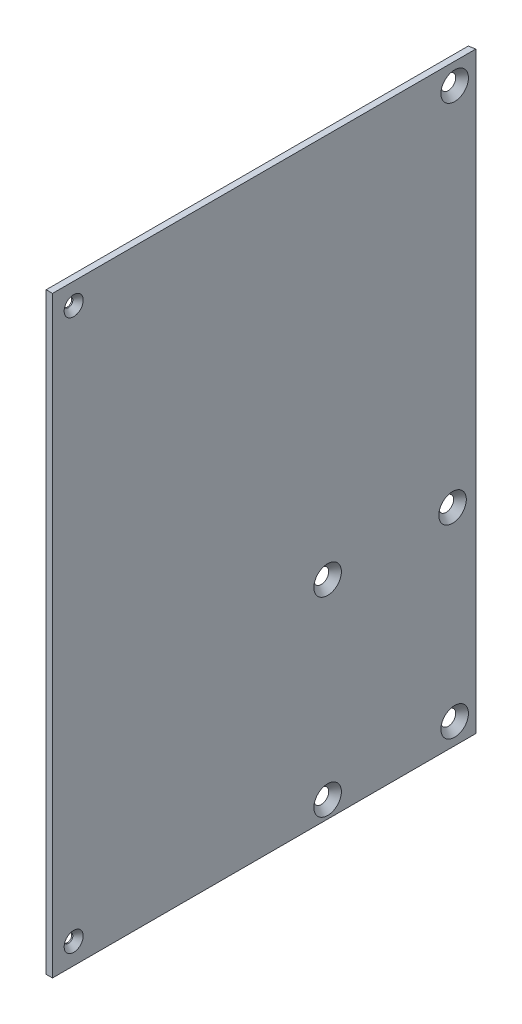
ISO-10303-21;
HEADER;
FILE_DESCRIPTION(('STEP AP214'),'2;1');
FILE_NAME('part.step','',(''),(''),'','','');
FILE_SCHEMA(('AUTOMOTIVE_DESIGN { 1 0 10303 214 1 1 1 1 }'));
ENDSEC;
DATA;
#1=APPLICATION_CONTEXT('core data for automotive mechanical design processes');
#2=APPLICATION_PROTOCOL_DEFINITION('international standard','automotive_design',2000,#1);
#3=PRODUCT_CONTEXT('',#1,'mechanical');
#4=PRODUCT('Part','Part','',(#3));
#5=PRODUCT_RELATED_PRODUCT_CATEGORY('part','',(#4));
#6=PRODUCT_DEFINITION_FORMATION('','',#4);
#7=PRODUCT_DEFINITION_CONTEXT('part definition',#1,'design');
#8=PRODUCT_DEFINITION('design','',#6,#7);
#9=PRODUCT_DEFINITION_SHAPE('','',#8);
#10=(LENGTH_UNIT() NAMED_UNIT(*) SI_UNIT(.MILLI.,.METRE.));
#11=(NAMED_UNIT(*) PLANE_ANGLE_UNIT() SI_UNIT($,.RADIAN.));
#12=(NAMED_UNIT(*) SI_UNIT($,.STERADIAN.) SOLID_ANGLE_UNIT());
#13=UNCERTAINTY_MEASURE_WITH_UNIT(LENGTH_MEASURE(1.E-05),#10,'distance_accuracy_value','');
#14=(GEOMETRIC_REPRESENTATION_CONTEXT(3) GLOBAL_UNCERTAINTY_ASSIGNED_CONTEXT((#13)) GLOBAL_UNIT_ASSIGNED_CONTEXT((#10,
#11,#12)) REPRESENTATION_CONTEXT('',''));
#15=CARTESIAN_POINT('',(0.,0.,0.));
#16=DIRECTION('',(0.,0.,1.));
#17=DIRECTION('',(1.,0.,0.));
#18=AXIS2_PLACEMENT_3D('',#15,#16,#17);
#19=CARTESIAN_POINT('',(82.9035305009001,138.,134.399262949457));
#20=DIRECTION('',(1.,0.,0.));
#21=DIRECTION('',(0.,0.,-1.));
#22=AXIS2_PLACEMENT_3D('',#19,#20,#21);
#23=CONICAL_SURFACE('',#22,2.25,0.785398163397448);
#24=CARTESIAN_POINT('',(81.6785305009001,138.,134.399262949457));
#25=DIRECTION('',(1.,0.,0.));
#26=DIRECTION('',(0.,0.,-1.));
#27=AXIS2_PLACEMENT_3D('',#24,#25,#26);
#28=CIRCLE('',#27,1.025);
#29=CARTESIAN_POINT('',(81.6785305009001,138.,133.374262949457));
#30=VERTEX_POINT('',#29);
#31=EDGE_CURVE('E187',#30,#30,#28,.T.);
#32=ORIENTED_EDGE('',*,*,#31,.F.);
#33=EDGE_LOOP('',(#32));
#34=FACE_BOUND('',#33,.T.);
#35=CARTESIAN_POINT('',(82.9035305009001,138.,134.399262949457));
#36=DIRECTION('',(1.,0.,0.));
#37=DIRECTION('',(0.,0.,-1.));
#38=AXIS2_PLACEMENT_3D('',#35,#36,#37);
#39=CIRCLE('',#38,2.25);
#40=CARTESIAN_POINT('',(82.9035305009001,138.,132.149262949457));
#41=VERTEX_POINT('',#40);
#42=EDGE_CURVE('E183',#41,#41,#39,.T.);
#43=ORIENTED_EDGE('',*,*,#42,.T.);
#44=EDGE_LOOP('',(#43));
#45=FACE_BOUND('',#44,.T.);
#46=ADVANCED_FACE('F52',(#34,#45),#23,.F.);
#47=CARTESIAN_POINT('',(82.9035305009001,138.,134.399262949457));
#48=DIRECTION('',(1.,0.,0.));
#49=DIRECTION('',(0.,0.,-1.));
#50=AXIS2_PLACEMENT_3D('',#47,#48,#49);
#51=CYLINDRICAL_SURFACE('',#50,1.025);
#52=ORIENTED_EDGE('',*,*,#31,.T.);
#53=EDGE_LOOP('',(#52));
#54=FACE_BOUND('',#53,.T.);
#55=CARTESIAN_POINT('',(81.4035305009001,138.,134.399262949457));
#56=DIRECTION('',(-1.,0.,0.));
#57=DIRECTION('',(0.,0.,1.));
#58=AXIS2_PLACEMENT_3D('',#55,#56,#57);
#59=CIRCLE('',#58,1.025);
#60=CARTESIAN_POINT('',(81.4035305009001,138.,135.424262949457));
#61=VERTEX_POINT('',#60);
#62=EDGE_CURVE('E175',#61,#61,#59,.F.);
#63=ORIENTED_EDGE('',*,*,#62,.F.);
#64=EDGE_LOOP('',(#63));
#65=FACE_BOUND('',#64,.T.);
#66=ADVANCED_FACE('F219',(#54,#65),#51,.F.);
#67=CARTESIAN_POINT('',(82.9035305009001,138.,44.4332950003212));
#68=DIRECTION('',(1.,0.,0.));
#69=DIRECTION('',(0.,0.,-1.));
#70=AXIS2_PLACEMENT_3D('',#67,#68,#69);
#71=CONICAL_SURFACE('',#70,3.25,0.785398163397448);
#72=CARTESIAN_POINT('',(82.9035305009001,138.,44.4332950003212));
#73=DIRECTION('',(1.,0.,0.));
#74=DIRECTION('',(0.,0.,-1.));
#75=AXIS2_PLACEMENT_3D('',#72,#73,#74);
#76=CIRCLE('',#75,3.25);
#77=CARTESIAN_POINT('',(82.9035305009001,138.,41.1832950003211));
#78=VERTEX_POINT('',#77);
#79=EDGE_CURVE('E179',#78,#78,#76,.T.);
#80=ORIENTED_EDGE('',*,*,#79,.T.);
#81=EDGE_LOOP('',(#80));
#82=FACE_BOUND('',#81,.T.);
#83=CARTESIAN_POINT('',(81.4035305009001,138.,44.4332950003212));
#84=DIRECTION('',(-1.,0.,0.));
#85=DIRECTION('',(0.,0.,1.));
#86=AXIS2_PLACEMENT_3D('',#83,#84,#85);
#87=CIRCLE('',#86,1.75);
#88=CARTESIAN_POINT('',(81.4035305009001,138.,46.1832950003212));
#89=VERTEX_POINT('',#88);
#90=EDGE_CURVE('E171',#89,#89,#87,.F.);
#91=ORIENTED_EDGE('',*,*,#90,.F.);
#92=EDGE_LOOP('',(#91));
#93=FACE_BOUND('',#92,.T.);
#94=ADVANCED_FACE('F227',(#82,#93),#71,.F.);
#95=CARTESIAN_POINT('',(80.9035305009001,143.,39.4332950003212));
#96=DIRECTION('',(0.,1.,0.));
#97=DIRECTION('',(0.,0.,1.));
#98=AXIS2_PLACEMENT_3D('',#95,#96,#97);
#99=PLANE('',#98);
#100=DIRECTION('',(-0.983268675216208,0.,0.18216122622162));
#101=VECTOR('',#100,1.);
#102=CARTESIAN_POINT('',(80.9035305009001,143.,39.8038167728806));
#103=LINE('',#102,#101);
#104=CARTESIAN_POINT('',(82.9035305009001,143.,39.4332950003212));
#105=VERTEX_POINT('',#104);
#106=CARTESIAN_POINT('',(81.4035305009001,143.,39.7111863297407));
#107=VERTEX_POINT('',#106);
#108=EDGE_CURVE('E191',#105,#107,#103,.T.);
#109=ORIENTED_EDGE('',*,*,#108,.T.);
#110=DIRECTION('',(0.,0.,-1.));
#111=VECTOR('',#110,1.);
#112=CARTESIAN_POINT('',(81.4035305009001,143.,139.399262949457));
#113=LINE('',#112,#111);
#114=CARTESIAN_POINT('',(81.4035305009001,143.,139.399262949457));
#115=VERTEX_POINT('',#114);
#116=EDGE_CURVE('E166',#115,#107,#113,.T.);
#117=ORIENTED_EDGE('',*,*,#116,.F.);
#118=DIRECTION('',(1.,0.,0.));
#119=VECTOR('',#118,1.);
#120=CARTESIAN_POINT('',(80.9035305009001,143.,139.399262949457));
#121=LINE('',#120,#119);
#122=CARTESIAN_POINT('',(82.9035305009001,143.,139.399262949457));
#123=VERTEX_POINT('',#122);
#124=EDGE_CURVE('E11',#115,#123,#121,.T.);
#125=ORIENTED_EDGE('',*,*,#124,.T.);
#126=DIRECTION('',(0.,0.,1.));
#127=VECTOR('',#126,1.);
#128=CARTESIAN_POINT('',(82.9035305009001,143.,39.4332950003212));
#129=LINE('',#128,#127);
#130=EDGE_CURVE('E97',#105,#123,#129,.T.);
#131=ORIENTED_EDGE('',*,*,#130,.F.);
#132=EDGE_LOOP('',(#109,#117,#125,#131));
#133=FACE_BOUND('',#132,.T.);
#134=ADVANCED_FACE('F54',(#133),#99,.T.);
#135=CARTESIAN_POINT('',(81.4035305009001,-34.,0.));
#136=DIRECTION('',(-1.,0.,0.));
#137=DIRECTION('',(0.,0.,1.));
#138=AXIS2_PLACEMENT_3D('',#135,#136,#137);
#139=PLANE('',#138);
#140=DIRECTION('',(0.,-1.,0.));
#141=VECTOR('',#140,1.);
#142=CARTESIAN_POINT('',(81.4035305009001,146.,39.7111863297407));
#143=LINE('',#142,#141);
#144=CARTESIAN_POINT('',(81.4035305009001,3.,39.7111863297407));
#145=VERTEX_POINT('',#144);
#146=EDGE_CURVE('E130',#107,#145,#143,.T.);
#147=ORIENTED_EDGE('',*,*,#146,.T.);
#148=DIRECTION('',(0.,0.,1.));
#149=VECTOR('',#148,1.);
#150=CARTESIAN_POINT('',(81.4035305009001,3.,39.8038167728806));
#151=LINE('',#150,#149);
#152=CARTESIAN_POINT('',(81.4035305009001,3.,139.399262949457));
#153=VERTEX_POINT('',#152);
#154=EDGE_CURVE('E125',#145,#153,#151,.T.);
#155=ORIENTED_EDGE('',*,*,#154,.T.);
#156=DIRECTION('',(0.,1.,0.));
#157=VECTOR('',#156,1.);
#158=CARTESIAN_POINT('',(81.4035305009001,-31.,139.399262949457));
#159=LINE('',#158,#157);
#160=EDGE_CURVE('E103',#153,#115,#159,.T.);
#161=ORIENTED_EDGE('',*,*,#160,.T.);
#162=ORIENTED_EDGE('',*,*,#116,.T.);
#163=EDGE_LOOP('',(#147,#155,#161,#162));
#164=FACE_BOUND('',#163,.T.);
#165=ORIENTED_EDGE('',*,*,#90,.T.);
#166=EDGE_LOOP('',(#165));
#167=FACE_BOUND('',#166,.T.);
#168=ORIENTED_EDGE('',*,*,#62,.T.);
#169=EDGE_LOOP('',(#168));
#170=FACE_BOUND('',#169,.T.);
#171=CARTESIAN_POINT('',(81.4035305009001,8.,134.399262949457));
#172=DIRECTION('',(-1.,0.,0.));
#173=DIRECTION('',(0.,0.,1.));
#174=AXIS2_PLACEMENT_3D('',#171,#172,#173);
#175=CIRCLE('',#174,1.025);
#176=CARTESIAN_POINT('',(81.4035305009001,8.,135.424262949457));
#177=VERTEX_POINT('',#176);
#178=EDGE_CURVE('E116',#177,#177,#175,.F.);
#179=ORIENTED_EDGE('',*,*,#178,.T.);
#180=EDGE_LOOP('',(#179));
#181=FACE_BOUND('',#180,.T.);
#182=CARTESIAN_POINT('',(81.4035305009001,8.,44.4332950003212));
#183=DIRECTION('',(-1.,0.,0.));
#184=DIRECTION('',(0.,0.,1.));
#185=AXIS2_PLACEMENT_3D('',#182,#183,#184);
#186=CIRCLE('',#185,1.74999999999999);
#187=CARTESIAN_POINT('',(81.4035305009001,8.,46.1832950003211));
#188=VERTEX_POINT('',#187);
#189=EDGE_CURVE('E149',#188,#188,#186,.F.);
#190=ORIENTED_EDGE('',*,*,#189,.T.);
#191=EDGE_LOOP('',(#190));
#192=FACE_BOUND('',#191,.T.);
#193=CARTESIAN_POINT('',(81.4035305009001,7.,74.4332950003211));
#194=DIRECTION('',(-1.,0.,0.));
#195=DIRECTION('',(0.,0.,1.));
#196=AXIS2_PLACEMENT_3D('',#193,#194,#195);
#197=CIRCLE('',#196,1.75);
#198=CARTESIAN_POINT('',(81.4035305009001,7.,76.1832950003211));
#199=VERTEX_POINT('',#198);
#200=EDGE_CURVE('E153',#199,#199,#197,.F.);
#201=ORIENTED_EDGE('',*,*,#200,.T.);
#202=EDGE_LOOP('',(#201));
#203=FACE_BOUND('',#202,.T.);
#204=CARTESIAN_POINT('',(81.4035305009001,52.,44.9332950003212));
#205=DIRECTION('',(-1.,0.,0.));
#206=DIRECTION('',(0.,0.,1.));
#207=AXIS2_PLACEMENT_3D('',#204,#205,#206);
#208=CIRCLE('',#207,1.74999999999999);
#209=CARTESIAN_POINT('',(81.4035305009001,52.,46.6832950003212));
#210=VERTEX_POINT('',#209);
#211=EDGE_CURVE('E157',#210,#210,#208,.F.);
#212=ORIENTED_EDGE('',*,*,#211,.T.);
#213=EDGE_LOOP('',(#212));
#214=FACE_BOUND('',#213,.T.);
#215=CARTESIAN_POINT('',(81.4035305009001,52.,74.4332950003211));
#216=DIRECTION('',(-1.,0.,0.));
#217=DIRECTION('',(0.,0.,1.));
#218=AXIS2_PLACEMENT_3D('',#215,#216,#217);
#219=CIRCLE('',#218,1.75);
#220=CARTESIAN_POINT('',(81.4035305009001,52.,76.1832950003211));
#221=VERTEX_POINT('',#220);
#222=EDGE_CURVE('E161',#221,#221,#219,.F.);
#223=ORIENTED_EDGE('',*,*,#222,.T.);
#224=EDGE_LOOP('',(#223));
#225=FACE_BOUND('',#224,.T.);
#226=ADVANCED_FACE('F202',(#164,#167,#170,#181,#192,#203,#214,#225),#139,.T.);
#227=CARTESIAN_POINT('',(80.9035305009001,145.034032050864,39.8038167728806));
#228=DIRECTION('',(0.182161226221619,0.,0.983268675216208));
#229=DIRECTION('',(0.983268675216208,0.,-0.18216122622162));
#230=AXIS2_PLACEMENT_3D('',#227,#228,#229);
#231=PLANE('',#230);
#232=DIRECTION('',(0.,1.,0.));
#233=VECTOR('',#232,1.);
#234=CARTESIAN_POINT('',(82.9035305009001,143.,39.4332950003212));
#235=LINE('',#234,#233);
#236=CARTESIAN_POINT('',(82.9035305009001,3.,39.4332950003212));
#237=VERTEX_POINT('',#236);
#238=EDGE_CURVE('E74',#237,#105,#235,.T.);
#239=ORIENTED_EDGE('',*,*,#238,.F.);
#240=DIRECTION('',(-0.983268675216208,0.,0.18216122622162));
#241=VECTOR('',#240,1.);
#242=CARTESIAN_POINT('',(80.9035305009001,3.,39.8038167728806));
#243=LINE('',#242,#241);
#244=EDGE_CURVE('E112',#237,#145,#243,.T.);
#245=ORIENTED_EDGE('',*,*,#244,.T.);
#246=ORIENTED_EDGE('',*,*,#146,.F.);
#247=ORIENTED_EDGE('',*,*,#108,.F.);
#248=EDGE_LOOP('',(#239,#245,#246,#247));
#249=FACE_BOUND('',#248,.T.);
#250=ADVANCED_FACE('F234',(#249),#231,.F.);
#251=CARTESIAN_POINT('',(82.9035305009001,-34.,0.));
#252=DIRECTION('',(-1.,0.,0.));
#253=DIRECTION('',(0.,0.,1.));
#254=AXIS2_PLACEMENT_3D('',#251,#252,#253);
#255=PLANE('',#254);
#256=ORIENTED_EDGE('',*,*,#79,.F.);
#257=EDGE_LOOP('',(#256));
#258=FACE_BOUND('',#257,.T.);
#259=ORIENTED_EDGE('',*,*,#42,.F.);
#260=EDGE_LOOP('',(#259));
#261=FACE_BOUND('',#260,.T.);
#262=DIRECTION('',(0.,-1.,0.));
#263=VECTOR('',#262,1.);
#264=CARTESIAN_POINT('',(82.9035305009001,143.,139.399262949457));
#265=LINE('',#264,#263);
#266=CARTESIAN_POINT('',(82.9035305009001,3.,139.399262949457));
#267=VERTEX_POINT('',#266);
#268=EDGE_CURVE('E61',#123,#267,#265,.T.);
#269=ORIENTED_EDGE('',*,*,#268,.T.);
#270=DIRECTION('',(0.,0.,-1.));
#271=VECTOR('',#270,1.);
#272=CARTESIAN_POINT('',(82.9035305009001,3.,39.4332950003212));
#273=LINE('',#272,#271);
#274=EDGE_CURVE('E96',#267,#237,#273,.T.);
#275=ORIENTED_EDGE('',*,*,#274,.T.);
#276=ORIENTED_EDGE('',*,*,#238,.T.);
#277=ORIENTED_EDGE('',*,*,#130,.T.);
#278=EDGE_LOOP('',(#269,#275,#276,#277));
#279=FACE_BOUND('',#278,.T.);
#280=CARTESIAN_POINT('',(82.9035305009001,52.,74.4332950003211));
#281=DIRECTION('',(1.,0.,0.));
#282=DIRECTION('',(0.,0.,-1.));
#283=AXIS2_PLACEMENT_3D('',#280,#281,#282);
#284=CIRCLE('',#283,3.25);
#285=CARTESIAN_POINT('',(82.9035305009001,52.,71.1832950003211));
#286=VERTEX_POINT('',#285);
#287=EDGE_CURVE('E131',#286,#286,#284,.T.);
#288=ORIENTED_EDGE('',*,*,#287,.F.);
#289=EDGE_LOOP('',(#288));
#290=FACE_BOUND('',#289,.T.);
#291=CARTESIAN_POINT('',(82.9035305009001,52.,44.9332950003212));
#292=DIRECTION('',(1.,0.,0.));
#293=DIRECTION('',(0.,0.,-1.));
#294=AXIS2_PLACEMENT_3D('',#291,#292,#293);
#295=CIRCLE('',#294,3.25);
#296=CARTESIAN_POINT('',(82.9035305009001,52.,41.6832950003212));
#297=VERTEX_POINT('',#296);
#298=EDGE_CURVE('E139',#297,#297,#295,.T.);
#299=ORIENTED_EDGE('',*,*,#298,.F.);
#300=EDGE_LOOP('',(#299));
#301=FACE_BOUND('',#300,.T.);
#302=CARTESIAN_POINT('',(82.9035305009001,7.,74.4332950003211));
#303=DIRECTION('',(1.,0.,0.));
#304=DIRECTION('',(0.,0.,-1.));
#305=AXIS2_PLACEMENT_3D('',#302,#303,#304);
#306=CIRCLE('',#305,3.25);
#307=CARTESIAN_POINT('',(82.9035305009001,7.,71.1832950003211));
#308=VERTEX_POINT('',#307);
#309=EDGE_CURVE('E135',#308,#308,#306,.T.);
#310=ORIENTED_EDGE('',*,*,#309,.F.);
#311=EDGE_LOOP('',(#310));
#312=FACE_BOUND('',#311,.T.);
#313=CARTESIAN_POINT('',(82.9035305009001,8.,44.4332950003212));
#314=DIRECTION('',(1.,0.,0.));
#315=DIRECTION('',(0.,0.,-1.));
#316=AXIS2_PLACEMENT_3D('',#313,#314,#315);
#317=CIRCLE('',#316,3.25);
#318=CARTESIAN_POINT('',(82.9035305009001,8.,41.1832950003212));
#319=VERTEX_POINT('',#318);
#320=EDGE_CURVE('E124',#319,#319,#317,.T.);
#321=ORIENTED_EDGE('',*,*,#320,.F.);
#322=EDGE_LOOP('',(#321));
#323=FACE_BOUND('',#322,.T.);
#324=CARTESIAN_POINT('',(82.9035305009001,8.,134.399262949457));
#325=DIRECTION('',(1.,0.,0.));
#326=DIRECTION('',(0.,0.,-1.));
#327=AXIS2_PLACEMENT_3D('',#324,#325,#326);
#328=CIRCLE('',#327,2.25);
#329=CARTESIAN_POINT('',(82.9035305009001,8.,132.149262949457));
#330=VERTEX_POINT('',#329);
#331=EDGE_CURVE('E126',#330,#330,#328,.T.);
#332=ORIENTED_EDGE('',*,*,#331,.F.);
#333=EDGE_LOOP('',(#332));
#334=FACE_BOUND('',#333,.T.);
#335=ADVANCED_FACE('F93',(#258,#261,#279,#290,#301,#312,#323,#334),#255,.F.);
#336=CARTESIAN_POINT('',(80.9035305009001,143.,139.399262949457));
#337=DIRECTION('',(0.,0.,1.));
#338=DIRECTION('',(1.,0.,0.));
#339=AXIS2_PLACEMENT_3D('',#336,#337,#338);
#340=PLANE('',#339);
#341=ORIENTED_EDGE('',*,*,#160,.F.);
#342=DIRECTION('',(1.,0.,0.));
#343=VECTOR('',#342,1.);
#344=CARTESIAN_POINT('',(80.9035305009001,3.,139.399262949457));
#345=LINE('',#344,#343);
#346=EDGE_CURVE('E101',#153,#267,#345,.T.);
#347=ORIENTED_EDGE('',*,*,#346,.T.);
#348=ORIENTED_EDGE('',*,*,#268,.F.);
#349=ORIENTED_EDGE('',*,*,#124,.F.);
#350=EDGE_LOOP('',(#341,#347,#348,#349));
#351=FACE_BOUND('',#350,.T.);
#352=ADVANCED_FACE('F102',(#351),#340,.T.);
#353=CARTESIAN_POINT('',(82.9035305009001,8.,134.399262949457));
#354=DIRECTION('',(1.,0.,0.));
#355=DIRECTION('',(0.,0.,-1.));
#356=AXIS2_PLACEMENT_3D('',#353,#354,#355);
#357=CYLINDRICAL_SURFACE('',#356,1.025);
#358=CARTESIAN_POINT('',(81.6785305009001,8.,134.399262949457));
#359=DIRECTION('',(1.,0.,0.));
#360=DIRECTION('',(0.,0.,-1.));
#361=AXIS2_PLACEMENT_3D('',#358,#359,#360);
#362=CIRCLE('',#361,1.025);
#363=CARTESIAN_POINT('',(81.6785305009001,8.,133.374262949457));
#364=VERTEX_POINT('',#363);
#365=EDGE_CURVE('E120',#364,#364,#362,.T.);
#366=ORIENTED_EDGE('',*,*,#365,.T.);
#367=EDGE_LOOP('',(#366));
#368=FACE_BOUND('',#367,.T.);
#369=ORIENTED_EDGE('',*,*,#178,.F.);
#370=EDGE_LOOP('',(#369));
#371=FACE_BOUND('',#370,.T.);
#372=ADVANCED_FACE('F241',(#368,#371),#357,.F.);
#373=CARTESIAN_POINT('',(82.9035305009001,8.,44.4332950003212));
#374=DIRECTION('',(1.,0.,0.));
#375=DIRECTION('',(0.,0.,-1.));
#376=AXIS2_PLACEMENT_3D('',#373,#374,#375);
#377=CONICAL_SURFACE('',#376,3.25,0.78539816339745);
#378=ORIENTED_EDGE('',*,*,#320,.T.);
#379=EDGE_LOOP('',(#378));
#380=FACE_BOUND('',#379,.T.);
#381=ORIENTED_EDGE('',*,*,#189,.F.);
#382=EDGE_LOOP('',(#381));
#383=FACE_BOUND('',#382,.T.);
#384=ADVANCED_FACE('F245',(#380,#383),#377,.F.);
#385=CARTESIAN_POINT('',(82.9035305009001,7.,74.4332950003211));
#386=DIRECTION('',(1.,0.,0.));
#387=DIRECTION('',(0.,0.,-1.));
#388=AXIS2_PLACEMENT_3D('',#385,#386,#387);
#389=CONICAL_SURFACE('',#388,3.25,0.78539816339745);
#390=ORIENTED_EDGE('',*,*,#309,.T.);
#391=EDGE_LOOP('',(#390));
#392=FACE_BOUND('',#391,.T.);
#393=ORIENTED_EDGE('',*,*,#200,.F.);
#394=EDGE_LOOP('',(#393));
#395=FACE_BOUND('',#394,.T.);
#396=ADVANCED_FACE('F214',(#392,#395),#389,.F.);
#397=CARTESIAN_POINT('',(82.9035305009001,52.,44.9332950003212));
#398=DIRECTION('',(1.,0.,0.));
#399=DIRECTION('',(0.,0.,-1.));
#400=AXIS2_PLACEMENT_3D('',#397,#398,#399);
#401=CONICAL_SURFACE('',#400,3.25,0.78539816339745);
#402=ORIENTED_EDGE('',*,*,#298,.T.);
#403=EDGE_LOOP('',(#402));
#404=FACE_BOUND('',#403,.T.);
#405=ORIENTED_EDGE('',*,*,#211,.F.);
#406=EDGE_LOOP('',(#405));
#407=FACE_BOUND('',#406,.T.);
#408=ADVANCED_FACE('F206',(#404,#407),#401,.F.);
#409=CARTESIAN_POINT('',(82.9035305009001,52.,74.4332950003211));
#410=DIRECTION('',(1.,0.,0.));
#411=DIRECTION('',(0.,0.,-1.));
#412=AXIS2_PLACEMENT_3D('',#409,#410,#411);
#413=CONICAL_SURFACE('',#412,3.25,0.78539816339745);
#414=ORIENTED_EDGE('',*,*,#287,.T.);
#415=EDGE_LOOP('',(#414));
#416=FACE_BOUND('',#415,.T.);
#417=ORIENTED_EDGE('',*,*,#222,.F.);
#418=EDGE_LOOP('',(#417));
#419=FACE_BOUND('',#418,.T.);
#420=ADVANCED_FACE('F204',(#416,#419),#413,.F.);
#421=CARTESIAN_POINT('',(80.9035305009001,3.,39.4332950003212));
#422=DIRECTION('',(0.,-1.,0.));
#423=DIRECTION('',(0.,0.,-1.));
#424=AXIS2_PLACEMENT_3D('',#421,#422,#423);
#425=PLANE('',#424);
#426=ORIENTED_EDGE('',*,*,#154,.F.);
#427=ORIENTED_EDGE('',*,*,#244,.F.);
#428=ORIENTED_EDGE('',*,*,#274,.F.);
#429=ORIENTED_EDGE('',*,*,#346,.F.);
#430=EDGE_LOOP('',(#426,#427,#428,#429));
#431=FACE_BOUND('',#430,.T.);
#432=ADVANCED_FACE('F110',(#431),#425,.T.);
#433=CARTESIAN_POINT('',(82.9035305009001,8.,134.399262949457));
#434=DIRECTION('',(1.,0.,0.));
#435=DIRECTION('',(0.,0.,-1.));
#436=AXIS2_PLACEMENT_3D('',#433,#434,#435);
#437=CONICAL_SURFACE('',#436,2.25,0.785398163397448);
#438=ORIENTED_EDGE('',*,*,#365,.F.);
#439=EDGE_LOOP('',(#438));
#440=FACE_BOUND('',#439,.T.);
#441=ORIENTED_EDGE('',*,*,#331,.T.);
#442=EDGE_LOOP('',(#441));
#443=FACE_BOUND('',#442,.T.);
#444=ADVANCED_FACE('F212',(#440,#443),#437,.F.);
#445=CLOSED_SHELL('',(#46,#66,#94,#134,#226,#250,#335,#352,#372,#384,#396,#408,#420,#432,#444));
#446=MANIFOLD_SOLID_BREP('B2',#445);
#447=ADVANCED_BREP_SHAPE_REPRESENTATION('',(#18,#446),#14);
#448=SHAPE_DEFINITION_REPRESENTATION(#9,#447);
ENDSEC;
END-ISO-10303-21;
